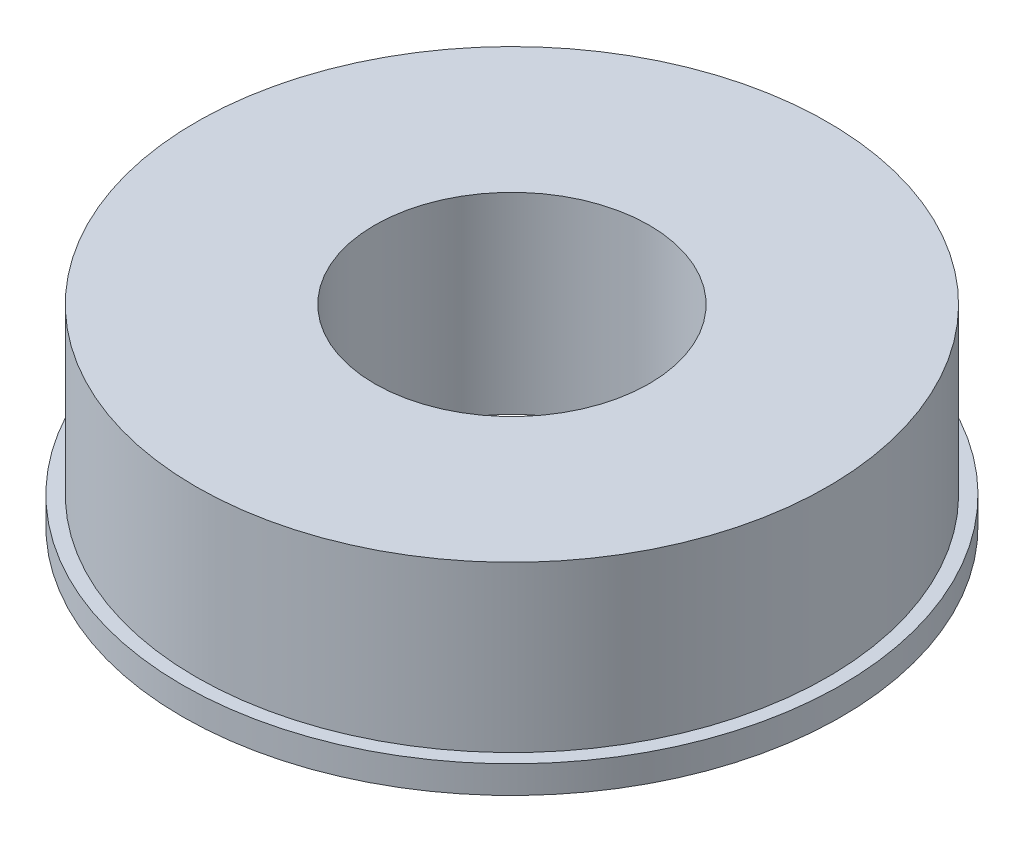
ISO-10303-21;
HEADER;
FILE_DESCRIPTION(('STEP AP214'),'2;1');
FILE_NAME('part.step','',(''),(''),'','','');
FILE_SCHEMA(('AUTOMOTIVE_DESIGN { 1 0 10303 214 1 1 1 1 }'));
ENDSEC;
DATA;
#1=APPLICATION_CONTEXT('core data for automotive mechanical design processes');
#2=APPLICATION_PROTOCOL_DEFINITION('international standard','automotive_design',2000,#1);
#3=PRODUCT_CONTEXT('',#1,'mechanical');
#4=PRODUCT('Part','Part','',(#3));
#5=PRODUCT_RELATED_PRODUCT_CATEGORY('part','',(#4));
#6=PRODUCT_DEFINITION_FORMATION('','',#4);
#7=PRODUCT_DEFINITION_CONTEXT('part definition',#1,'design');
#8=PRODUCT_DEFINITION('design','',#6,#7);
#9=PRODUCT_DEFINITION_SHAPE('','',#8);
#10=(LENGTH_UNIT() NAMED_UNIT(*) SI_UNIT(.MILLI.,.METRE.));
#11=(NAMED_UNIT(*) PLANE_ANGLE_UNIT() SI_UNIT($,.RADIAN.));
#12=(NAMED_UNIT(*) SI_UNIT($,.STERADIAN.) SOLID_ANGLE_UNIT());
#13=UNCERTAINTY_MEASURE_WITH_UNIT(LENGTH_MEASURE(1.E-05),#10,'distance_accuracy_value','');
#14=(GEOMETRIC_REPRESENTATION_CONTEXT(3) GLOBAL_UNCERTAINTY_ASSIGNED_CONTEXT((#13)) GLOBAL_UNIT_ASSIGNED_CONTEXT((#10,
#11,#12)) REPRESENTATION_CONTEXT('',''));
#15=CARTESIAN_POINT('',(0.,0.,0.));
#16=DIRECTION('',(0.,0.,1.));
#17=DIRECTION('',(1.,0.,0.));
#18=AXIS2_PLACEMENT_3D('',#15,#16,#17);
#19=CARTESIAN_POINT('',(0.,7.,0.));
#20=DIRECTION('',(0.,-1.,0.));
#21=DIRECTION('',(0.,0.,-1.));
#22=AXIS2_PLACEMENT_3D('',#19,#20,#21);
#23=CYLINDRICAL_SURFACE('',#22,12.);
#24=CARTESIAN_POINT('',(0.,0.,0.));
#25=DIRECTION('',(0.,1.,0.));
#26=DIRECTION('',(0.,0.,1.));
#27=AXIS2_PLACEMENT_3D('',#24,#25,#26);
#28=CIRCLE('',#27,12.);
#29=CARTESIAN_POINT('',(0.,0.,12.));
#30=VERTEX_POINT('',#29);
#31=EDGE_CURVE('E11',#30,#30,#28,.T.);
#32=ORIENTED_EDGE('',*,*,#31,.T.);
#33=EDGE_LOOP('',(#32));
#34=FACE_BOUND('',#33,.T.);
#35=CARTESIAN_POINT('',(0.,1.,0.));
#36=DIRECTION('',(0.,1.,0.));
#37=DIRECTION('',(0.,0.,1.));
#38=AXIS2_PLACEMENT_3D('',#35,#36,#37);
#39=CIRCLE('',#38,12.);
#40=CARTESIAN_POINT('',(0.,1.,12.));
#41=VERTEX_POINT('',#40);
#42=EDGE_CURVE('E35',#41,#41,#39,.T.);
#43=ORIENTED_EDGE('',*,*,#42,.F.);
#44=EDGE_LOOP('',(#43));
#45=FACE_BOUND('',#44,.T.);
#46=ADVANCED_FACE('F32',(#34,#45),#23,.T.);
#47=CARTESIAN_POINT('',(0.,0.,0.));
#48=DIRECTION('',(0.,1.,0.));
#49=DIRECTION('',(0.,0.,1.));
#50=AXIS2_PLACEMENT_3D('',#47,#48,#49);
#51=PLANE('',#50);
#52=CARTESIAN_POINT('',(0.,0.,0.));
#53=DIRECTION('',(0.,1.,0.));
#54=DIRECTION('',(0.,0.,1.));
#55=AXIS2_PLACEMENT_3D('',#52,#53,#54);
#56=CIRCLE('',#55,5.);
#57=CARTESIAN_POINT('',(0.,0.,5.));
#58=VERTEX_POINT('',#57);
#59=EDGE_CURVE('E47',#58,#58,#56,.F.);
#60=ORIENTED_EDGE('',*,*,#59,.F.);
#61=EDGE_LOOP('',(#60));
#62=FACE_BOUND('',#61,.T.);
#63=ORIENTED_EDGE('',*,*,#31,.F.);
#64=EDGE_LOOP('',(#63));
#65=FACE_BOUND('',#64,.T.);
#66=ADVANCED_FACE('F73',(#62,#65),#51,.F.);
#67=CARTESIAN_POINT('',(0.,1.,0.));
#68=DIRECTION('',(0.,1.,0.));
#69=DIRECTION('',(0.,0.,1.));
#70=AXIS2_PLACEMENT_3D('',#67,#68,#69);
#71=PLANE('',#70);
#72=CARTESIAN_POINT('',(0.,1.,0.));
#73=DIRECTION('',(0.,1.,0.));
#74=DIRECTION('',(0.,0.,1.));
#75=AXIS2_PLACEMENT_3D('',#72,#73,#74);
#76=CIRCLE('',#75,11.5);
#77=CARTESIAN_POINT('',(0.,1.,11.5));
#78=VERTEX_POINT('',#77);
#79=EDGE_CURVE('E42',#78,#78,#76,.T.);
#80=ORIENTED_EDGE('',*,*,#79,.F.);
#81=EDGE_LOOP('',(#80));
#82=FACE_BOUND('',#81,.T.);
#83=ORIENTED_EDGE('',*,*,#42,.T.);
#84=EDGE_LOOP('',(#83));
#85=FACE_BOUND('',#84,.T.);
#86=ADVANCED_FACE('F67',(#82,#85),#71,.T.);
#87=CARTESIAN_POINT('',(0.,1.,0.));
#88=DIRECTION('',(0.,1.,0.));
#89=DIRECTION('',(0.,0.,1.));
#90=AXIS2_PLACEMENT_3D('',#87,#88,#89);
#91=CYLINDRICAL_SURFACE('',#90,11.5);
#92=ORIENTED_EDGE('',*,*,#79,.T.);
#93=EDGE_LOOP('',(#92));
#94=FACE_BOUND('',#93,.T.);
#95=CARTESIAN_POINT('',(0.,7.,0.));
#96=DIRECTION('',(0.,1.,0.));
#97=DIRECTION('',(0.,0.,1.));
#98=AXIS2_PLACEMENT_3D('',#95,#96,#97);
#99=CIRCLE('',#98,11.5);
#100=CARTESIAN_POINT('',(0.,7.,11.5));
#101=VERTEX_POINT('',#100);
#102=EDGE_CURVE('E44',#101,#101,#99,.T.);
#103=ORIENTED_EDGE('',*,*,#102,.F.);
#104=EDGE_LOOP('',(#103));
#105=FACE_BOUND('',#104,.T.);
#106=ADVANCED_FACE('F62',(#94,#105),#91,.T.);
#107=CARTESIAN_POINT('',(0.,7.,0.));
#108=DIRECTION('',(0.,1.,0.));
#109=DIRECTION('',(0.,0.,1.));
#110=AXIS2_PLACEMENT_3D('',#107,#108,#109);
#111=PLANE('',#110);
#112=CARTESIAN_POINT('',(0.,7.,0.));
#113=DIRECTION('',(0.,1.,0.));
#114=DIRECTION('',(0.,0.,1.));
#115=AXIS2_PLACEMENT_3D('',#112,#113,#114);
#116=CIRCLE('',#115,5.);
#117=CARTESIAN_POINT('',(0.,7.,5.));
#118=VERTEX_POINT('',#117);
#119=EDGE_CURVE('E52',#118,#118,#116,.T.);
#120=ORIENTED_EDGE('',*,*,#119,.F.);
#121=EDGE_LOOP('',(#120));
#122=FACE_BOUND('',#121,.T.);
#123=ORIENTED_EDGE('',*,*,#102,.T.);
#124=EDGE_LOOP('',(#123));
#125=FACE_BOUND('',#124,.T.);
#126=ADVANCED_FACE('F59',(#122,#125),#111,.T.);
#127=CARTESIAN_POINT('',(0.,-0.00100000000000013,0.));
#128=DIRECTION('',(0.,1.,0.));
#129=DIRECTION('',(0.,0.,1.));
#130=AXIS2_PLACEMENT_3D('',#127,#128,#129);
#131=CYLINDRICAL_SURFACE('',#130,5.);
#132=ORIENTED_EDGE('',*,*,#119,.T.);
#133=EDGE_LOOP('',(#132));
#134=FACE_BOUND('',#133,.T.);
#135=ORIENTED_EDGE('',*,*,#59,.T.);
#136=EDGE_LOOP('',(#135));
#137=FACE_BOUND('',#136,.T.);
#138=ADVANCED_FACE('F56',(#134,#137),#131,.F.);
#139=CLOSED_SHELL('',(#46,#66,#86,#106,#126,#138));
#140=MANIFOLD_SOLID_BREP('B2',#139);
#141=ADVANCED_BREP_SHAPE_REPRESENTATION('',(#18,#140),#14);
#142=SHAPE_DEFINITION_REPRESENTATION(#9,#141);
ENDSEC;
END-ISO-10303-21;
